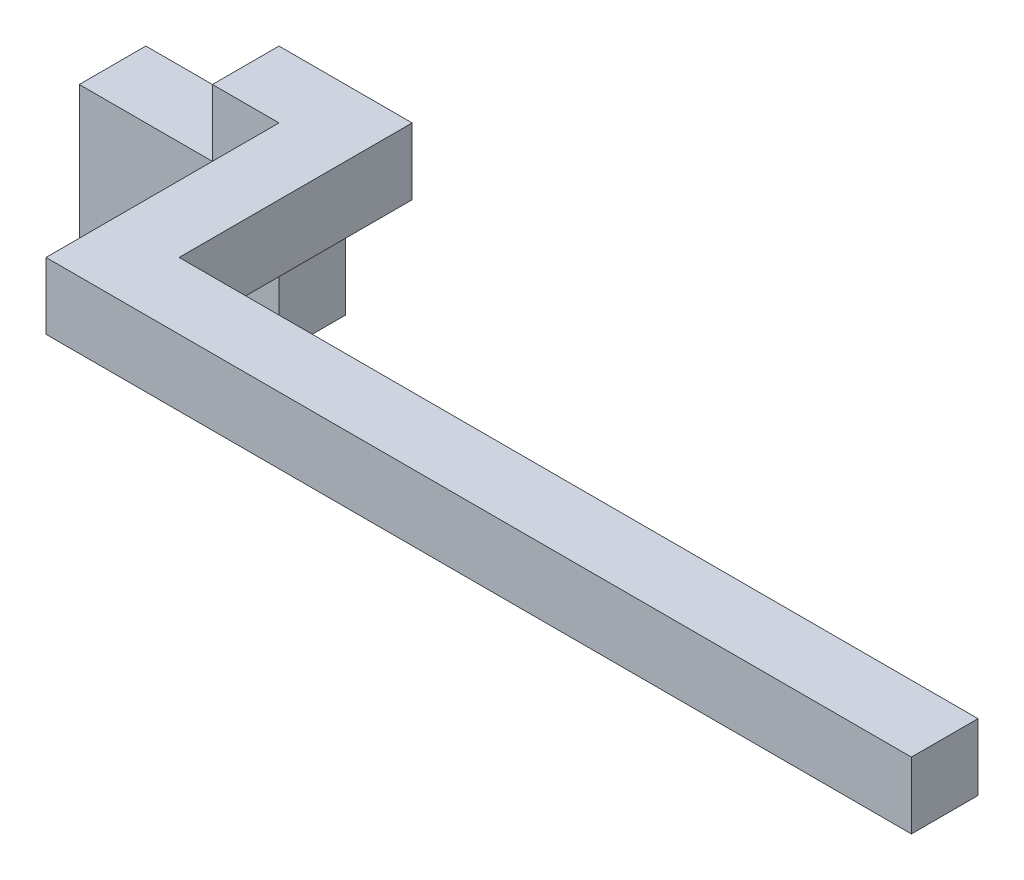
ISO-10303-21;
HEADER;
FILE_DESCRIPTION(('STEP AP214'),'2;1');
FILE_NAME('part.step','',(''),(''),'','','');
FILE_SCHEMA(('AUTOMOTIVE_DESIGN { 1 0 10303 214 1 1 1 1 }'));
ENDSEC;
DATA;
#1=APPLICATION_CONTEXT('core data for automotive mechanical design processes');
#2=APPLICATION_PROTOCOL_DEFINITION('international standard','automotive_design',2000,#1);
#3=PRODUCT_CONTEXT('',#1,'mechanical');
#4=PRODUCT('Part','Part','',(#3));
#5=PRODUCT_RELATED_PRODUCT_CATEGORY('part','',(#4));
#6=PRODUCT_DEFINITION_FORMATION('','',#4);
#7=PRODUCT_DEFINITION_CONTEXT('part definition',#1,'design');
#8=PRODUCT_DEFINITION('design','',#6,#7);
#9=PRODUCT_DEFINITION_SHAPE('','',#8);
#10=(LENGTH_UNIT() NAMED_UNIT(*) SI_UNIT(.MILLI.,.METRE.));
#11=(NAMED_UNIT(*) PLANE_ANGLE_UNIT() SI_UNIT($,.RADIAN.));
#12=(NAMED_UNIT(*) SI_UNIT($,.STERADIAN.) SOLID_ANGLE_UNIT());
#13=UNCERTAINTY_MEASURE_WITH_UNIT(LENGTH_MEASURE(1.E-05),#10,'distance_accuracy_value','');
#14=(GEOMETRIC_REPRESENTATION_CONTEXT(3) GLOBAL_UNCERTAINTY_ASSIGNED_CONTEXT((#13)) GLOBAL_UNIT_ASSIGNED_CONTEXT((#10,
#11,#12)) REPRESENTATION_CONTEXT('',''));
#15=CARTESIAN_POINT('',(0.,0.,0.));
#16=DIRECTION('',(0.,0.,1.));
#17=DIRECTION('',(1.,0.,0.));
#18=AXIS2_PLACEMENT_3D('',#15,#16,#17);
#19=CARTESIAN_POINT('',(330.2,-50.8,0.));
#20=DIRECTION('',(1.,0.,0.));
#21=DIRECTION('',(0.,0.,-1.));
#22=AXIS2_PLACEMENT_3D('',#19,#20,#21);
#23=PLANE('',#22);
#24=DIRECTION('',(0.,1.,0.));
#25=VECTOR('',#24,1.);
#26=CARTESIAN_POINT('',(330.2,-50.8,88.9));
#27=LINE('',#26,#25);
#28=CARTESIAN_POINT('',(330.2,0.,88.9));
#29=VERTEX_POINT('',#28);
#30=CARTESIAN_POINT('',(330.2,25.4,88.9));
#31=VERTEX_POINT('',#30);
#32=EDGE_CURVE('E192',#29,#31,#27,.T.);
#33=ORIENTED_EDGE('',*,*,#32,.T.);
#34=DIRECTION('',(0.,0.,1.));
#35=VECTOR('',#34,1.);
#36=CARTESIAN_POINT('',(330.2,25.4,0.));
#37=LINE('',#36,#35);
#38=CARTESIAN_POINT('',(330.2,25.4,114.3));
#39=VERTEX_POINT('',#38);
#40=EDGE_CURVE('E156',#31,#39,#37,.T.);
#41=ORIENTED_EDGE('',*,*,#40,.T.);
#42=DIRECTION('',(0.,1.,0.));
#43=VECTOR('',#42,1.);
#44=CARTESIAN_POINT('',(330.2,25.4,114.3));
#45=LINE('',#44,#43);
#46=CARTESIAN_POINT('',(330.2,0.,114.3));
#47=VERTEX_POINT('',#46);
#48=EDGE_CURVE('E169',#47,#39,#45,.T.);
#49=ORIENTED_EDGE('',*,*,#48,.F.);
#50=DIRECTION('',(0.,0.,-1.));
#51=VECTOR('',#50,1.);
#52=CARTESIAN_POINT('',(330.2,0.,25.4));
#53=LINE('',#52,#51);
#54=EDGE_CURVE('E164',#47,#29,#53,.T.);
#55=ORIENTED_EDGE('',*,*,#54,.T.);
#56=EDGE_LOOP('',(#33,#41,#49,#55));
#57=FACE_BOUND('',#56,.T.);
#58=ADVANCED_FACE('F33',(#57),#23,.T.);
#59=CARTESIAN_POINT('',(-76.2,-50.8,0.));
#60=DIRECTION('',(0.,-1.,0.));
#61=DIRECTION('',(0.,0.,-1.));
#62=AXIS2_PLACEMENT_3D('',#59,#60,#61);
#63=PLANE('',#62);
#64=DIRECTION('',(0.,0.,-1.));
#65=VECTOR('',#64,1.);
#66=CARTESIAN_POINT('',(0.,-50.8,25.4));
#67=LINE('',#66,#65);
#68=CARTESIAN_POINT('',(0.,-50.8,25.4));
#69=VERTEX_POINT('',#68);
#70=CARTESIAN_POINT('',(0.,-50.8,0.));
#71=VERTEX_POINT('',#70);
#72=EDGE_CURVE('E151',#69,#71,#67,.T.);
#73=ORIENTED_EDGE('',*,*,#72,.F.);
#74=DIRECTION('',(1.,0.,0.));
#75=VECTOR('',#74,1.);
#76=CARTESIAN_POINT('',(-76.2,-50.8,25.4));
#77=LINE('',#76,#75);
#78=CARTESIAN_POINT('',(-76.2,-50.8,25.4));
#79=VERTEX_POINT('',#78);
#80=EDGE_CURVE('E143',#79,#69,#77,.T.);
#81=ORIENTED_EDGE('',*,*,#80,.F.);
#82=DIRECTION('',(0.,0.,1.));
#83=VECTOR('',#82,1.);
#84=CARTESIAN_POINT('',(-76.2,-50.8,0.));
#85=LINE('',#84,#83);
#86=CARTESIAN_POINT('',(-76.2,-50.8,0.));
#87=VERTEX_POINT('',#86);
#88=EDGE_CURVE('E179',#87,#79,#85,.T.);
#89=ORIENTED_EDGE('',*,*,#88,.F.);
#90=DIRECTION('',(1.,0.,0.));
#91=VECTOR('',#90,1.);
#92=CARTESIAN_POINT('',(-76.2,-50.8,0.));
#93=LINE('',#92,#91);
#94=EDGE_CURVE('E145',#87,#71,#93,.T.);
#95=ORIENTED_EDGE('',*,*,#94,.T.);
#96=EDGE_LOOP('',(#73,#81,#89,#95));
#97=FACE_BOUND('',#96,.T.);
#98=ADVANCED_FACE('F227',(#97),#63,.T.);
#99=CARTESIAN_POINT('',(-76.2,25.4,0.));
#100=DIRECTION('',(-1.,0.,0.));
#101=DIRECTION('',(0.,0.,1.));
#102=AXIS2_PLACEMENT_3D('',#99,#100,#101);
#103=PLANE('',#102);
#104=DIRECTION('',(0.,0.,1.));
#105=VECTOR('',#104,1.);
#106=CARTESIAN_POINT('',(-76.2,0.,0.));
#107=LINE('',#106,#105);
#108=CARTESIAN_POINT('',(-76.2,0.,0.));
#109=VERTEX_POINT('',#108);
#110=CARTESIAN_POINT('',(-76.2,0.,25.4));
#111=VERTEX_POINT('',#110);
#112=EDGE_CURVE('E55',#109,#111,#107,.T.);
#113=ORIENTED_EDGE('',*,*,#112,.F.);
#114=DIRECTION('',(0.,-1.,0.));
#115=VECTOR('',#114,1.);
#116=CARTESIAN_POINT('',(-76.2,25.4,0.));
#117=LINE('',#116,#115);
#118=EDGE_CURVE('E142',#109,#87,#117,.T.);
#119=ORIENTED_EDGE('',*,*,#118,.T.);
#120=ORIENTED_EDGE('',*,*,#88,.T.);
#121=DIRECTION('',(0.,-1.,0.));
#122=VECTOR('',#121,1.);
#123=CARTESIAN_POINT('',(-76.2,25.4,25.4));
#124=LINE('',#123,#122);
#125=EDGE_CURVE('E148',#111,#79,#124,.T.);
#126=ORIENTED_EDGE('',*,*,#125,.F.);
#127=EDGE_LOOP('',(#113,#119,#120,#126));
#128=FACE_BOUND('',#127,.T.);
#129=ADVANCED_FACE('F232',(#128),#103,.T.);
#130=CARTESIAN_POINT('',(330.2,25.4,0.));
#131=DIRECTION('',(0.,1.,0.));
#132=DIRECTION('',(0.,0.,1.));
#133=AXIS2_PLACEMENT_3D('',#130,#131,#132);
#134=PLANE('',#133);
#135=DIRECTION('',(1.,0.,0.));
#136=VECTOR('',#135,1.);
#137=CARTESIAN_POINT('',(25.4,25.4,88.9));
#138=LINE('',#137,#136);
#139=CARTESIAN_POINT('',(25.4,25.4,88.9));
#140=VERTEX_POINT('',#139);
#141=EDGE_CURVE('E127',#140,#31,#138,.T.);
#142=ORIENTED_EDGE('',*,*,#141,.F.);
#143=DIRECTION('',(0.,0.,1.));
#144=VECTOR('',#143,1.);
#145=CARTESIAN_POINT('',(25.4,25.4,0.));
#146=LINE('',#145,#144);
#147=CARTESIAN_POINT('',(25.4,25.4,0.));
#148=VERTEX_POINT('',#147);
#149=EDGE_CURVE('E120',#148,#140,#146,.T.);
#150=ORIENTED_EDGE('',*,*,#149,.F.);
#151=DIRECTION('',(-1.,0.,0.));
#152=VECTOR('',#151,1.);
#153=CARTESIAN_POINT('',(330.2,25.4,0.));
#154=LINE('',#153,#152);
#155=CARTESIAN_POINT('',(-25.4,25.4,0.));
#156=VERTEX_POINT('',#155);
#157=EDGE_CURVE('E132',#148,#156,#154,.T.);
#158=ORIENTED_EDGE('',*,*,#157,.T.);
#159=DIRECTION('',(0.,0.,1.));
#160=VECTOR('',#159,1.);
#161=CARTESIAN_POINT('',(-25.4,25.4,0.));
#162=LINE('',#161,#160);
#163=CARTESIAN_POINT('',(-25.4,25.4,25.4));
#164=VERTEX_POINT('',#163);
#165=EDGE_CURVE('E170',#156,#164,#162,.T.);
#166=ORIENTED_EDGE('',*,*,#165,.T.);
#167=DIRECTION('',(-1.,0.,0.));
#168=VECTOR('',#167,1.);
#169=CARTESIAN_POINT('',(330.2,25.4,25.4));
#170=LINE('',#169,#168);
#171=CARTESIAN_POINT('',(0.,25.4,25.4));
#172=VERTEX_POINT('',#171);
#173=EDGE_CURVE('E160',#172,#164,#170,.T.);
#174=ORIENTED_EDGE('',*,*,#173,.F.);
#175=DIRECTION('',(0.,0.,-1.));
#176=VECTOR('',#175,1.);
#177=CARTESIAN_POINT('',(0.,25.4,114.3));
#178=LINE('',#177,#176);
#179=CARTESIAN_POINT('',(0.,25.4,114.3));
#180=VERTEX_POINT('',#179);
#181=EDGE_CURVE('E173',#180,#172,#178,.T.);
#182=ORIENTED_EDGE('',*,*,#181,.F.);
#183=DIRECTION('',(-1.,0.,0.));
#184=VECTOR('',#183,1.);
#185=CARTESIAN_POINT('',(0.,25.4,114.3));
#186=LINE('',#185,#184);
#187=EDGE_CURVE('E194',#39,#180,#186,.T.);
#188=ORIENTED_EDGE('',*,*,#187,.F.);
#189=ORIENTED_EDGE('',*,*,#40,.F.);
#190=EDGE_LOOP('',(#142,#150,#158,#166,#174,#182,#188,#189));
#191=FACE_BOUND('',#190,.T.);
#192=ADVANCED_FACE('F130',(#191),#134,.T.);
#193=CARTESIAN_POINT('',(0.,0.,0.));
#194=DIRECTION('',(0.,0.,1.));
#195=DIRECTION('',(1.,0.,0.));
#196=AXIS2_PLACEMENT_3D('',#193,#194,#195);
#197=PLANE('',#196);
#198=CARTESIAN_POINT('',(12.7,12.7,0.));
#199=DIRECTION('',(0.,0.,-1.));
#200=DIRECTION('',(0.,1.,0.));
#201=AXIS2_PLACEMENT_3D('',#198,#199,#200);
#202=CIRCLE('',#201,6.35000000000001);
#203=CARTESIAN_POINT('',(12.7,19.05,0.));
#204=VERTEX_POINT('',#203);
#205=EDGE_CURVE('E256',#204,#204,#202,.T.);
#206=ORIENTED_EDGE('',*,*,#205,.F.);
#207=EDGE_LOOP('',(#206));
#208=FACE_BOUND('',#207,.T.);
#209=ORIENTED_EDGE('',*,*,#157,.F.);
#210=DIRECTION('',(0.,1.,0.));
#211=VECTOR('',#210,1.);
#212=CARTESIAN_POINT('',(25.4,-50.8,0.));
#213=LINE('',#212,#211);
#214=CARTESIAN_POINT('',(25.4,0.,0.));
#215=VERTEX_POINT('',#214);
#216=EDGE_CURVE('E117',#215,#148,#213,.T.);
#217=ORIENTED_EDGE('',*,*,#216,.F.);
#218=DIRECTION('',(1.,0.,0.));
#219=VECTOR('',#218,1.);
#220=CARTESIAN_POINT('',(0.,0.,0.));
#221=LINE('',#220,#219);
#222=CARTESIAN_POINT('',(0.,0.,0.));
#223=VERTEX_POINT('',#222);
#224=EDGE_CURVE('E214',#223,#215,#221,.T.);
#225=ORIENTED_EDGE('',*,*,#224,.F.);
#226=DIRECTION('',(0.,1.,0.));
#227=VECTOR('',#226,1.);
#228=CARTESIAN_POINT('',(0.,-50.8,0.));
#229=LINE('',#228,#227);
#230=EDGE_CURVE('E176',#71,#223,#229,.T.);
#231=ORIENTED_EDGE('',*,*,#230,.F.);
#232=ORIENTED_EDGE('',*,*,#94,.F.);
#233=ORIENTED_EDGE('',*,*,#118,.F.);
#234=DIRECTION('',(1.,0.,0.));
#235=VECTOR('',#234,1.);
#236=CARTESIAN_POINT('',(-76.2,0.,0.));
#237=LINE('',#236,#235);
#238=CARTESIAN_POINT('',(-25.4,0.,0.));
#239=VERTEX_POINT('',#238);
#240=EDGE_CURVE('E234',#109,#239,#237,.T.);
#241=ORIENTED_EDGE('',*,*,#240,.T.);
#242=DIRECTION('',(0.,1.,0.));
#243=VECTOR('',#242,1.);
#244=CARTESIAN_POINT('',(-25.4,0.,0.));
#245=LINE('',#244,#243);
#246=EDGE_CURVE('E141',#239,#156,#245,.T.);
#247=ORIENTED_EDGE('',*,*,#246,.T.);
#248=EDGE_LOOP('',(#209,#217,#225,#231,#232,#233,#241,#247));
#249=FACE_BOUND('',#248,.T.);
#250=ADVANCED_FACE('F138',(#208,#249),#197,.F.);
#251=CARTESIAN_POINT('',(0.,0.,25.4));
#252=DIRECTION('',(0.,0.,1.));
#253=DIRECTION('',(1.,0.,0.));
#254=AXIS2_PLACEMENT_3D('',#251,#252,#253);
#255=PLANE('',#254);
#256=DIRECTION('',(0.,1.,0.));
#257=VECTOR('',#256,1.);
#258=CARTESIAN_POINT('',(-25.4,0.,25.4));
#259=LINE('',#258,#257);
#260=CARTESIAN_POINT('',(-25.4,0.,25.4));
#261=VERTEX_POINT('',#260);
#262=EDGE_CURVE('E235',#261,#164,#259,.T.);
#263=ORIENTED_EDGE('',*,*,#262,.F.);
#264=DIRECTION('',(1.,0.,0.));
#265=VECTOR('',#264,1.);
#266=CARTESIAN_POINT('',(-76.2,0.,25.4));
#267=LINE('',#266,#265);
#268=EDGE_CURVE('E231',#111,#261,#267,.T.);
#269=ORIENTED_EDGE('',*,*,#268,.F.);
#270=ORIENTED_EDGE('',*,*,#125,.T.);
#271=ORIENTED_EDGE('',*,*,#80,.T.);
#272=DIRECTION('',(0.,1.,0.));
#273=VECTOR('',#272,1.);
#274=CARTESIAN_POINT('',(0.,-50.8,25.4));
#275=LINE('',#274,#273);
#276=CARTESIAN_POINT('',(0.,0.,25.4));
#277=VERTEX_POINT('',#276);
#278=EDGE_CURVE('E212',#69,#277,#275,.T.);
#279=ORIENTED_EDGE('',*,*,#278,.T.);
#280=DIRECTION('',(0.,-1.,0.));
#281=VECTOR('',#280,1.);
#282=CARTESIAN_POINT('',(0.,0.,25.4));
#283=LINE('',#282,#281);
#284=EDGE_CURVE('E166',#172,#277,#283,.T.);
#285=ORIENTED_EDGE('',*,*,#284,.F.);
#286=ORIENTED_EDGE('',*,*,#173,.T.);
#287=EDGE_LOOP('',(#263,#269,#270,#271,#279,#285,#286));
#288=FACE_BOUND('',#287,.T.);
#289=ADVANCED_FACE('F230',(#288),#255,.T.);
#290=CARTESIAN_POINT('',(0.,0.,25.4));
#291=DIRECTION('',(0.,1.,0.));
#292=DIRECTION('',(0.,0.,1.));
#293=AXIS2_PLACEMENT_3D('',#290,#291,#292);
#294=PLANE('',#293);
#295=DIRECTION('',(0.,0.,1.));
#296=VECTOR('',#295,1.);
#297=CARTESIAN_POINT('',(25.4,0.,25.4));
#298=LINE('',#297,#296);
#299=CARTESIAN_POINT('',(25.4,0.,88.9));
#300=VERTEX_POINT('',#299);
#301=EDGE_CURVE('E40',#215,#300,#298,.T.);
#302=ORIENTED_EDGE('',*,*,#301,.T.);
#303=DIRECTION('',(1.,0.,0.));
#304=VECTOR('',#303,1.);
#305=CARTESIAN_POINT('',(0.,0.,88.9));
#306=LINE('',#305,#304);
#307=EDGE_CURVE('E11',#300,#29,#306,.T.);
#308=ORIENTED_EDGE('',*,*,#307,.T.);
#309=ORIENTED_EDGE('',*,*,#54,.F.);
#310=DIRECTION('',(1.,0.,0.));
#311=VECTOR('',#310,1.);
#312=CARTESIAN_POINT('',(330.2,0.,114.3));
#313=LINE('',#312,#311);
#314=CARTESIAN_POINT('',(0.,0.,114.3));
#315=VERTEX_POINT('',#314);
#316=EDGE_CURVE('E203',#315,#47,#313,.T.);
#317=ORIENTED_EDGE('',*,*,#316,.F.);
#318=DIRECTION('',(0.,0.,-1.));
#319=VECTOR('',#318,1.);
#320=CARTESIAN_POINT('',(0.,0.,114.3));
#321=LINE('',#320,#319);
#322=EDGE_CURVE('E177',#315,#277,#321,.T.);
#323=ORIENTED_EDGE('',*,*,#322,.T.);
#324=DIRECTION('',(0.,0.,-1.));
#325=VECTOR('',#324,1.);
#326=CARTESIAN_POINT('',(0.,0.,25.4));
#327=LINE('',#326,#325);
#328=EDGE_CURVE('E218',#277,#223,#327,.T.);
#329=ORIENTED_EDGE('',*,*,#328,.T.);
#330=ORIENTED_EDGE('',*,*,#224,.T.);
#331=EDGE_LOOP('',(#302,#308,#309,#317,#323,#329,#330));
#332=FACE_BOUND('',#331,.T.);
#333=ADVANCED_FACE('F248',(#332),#294,.F.);
#334=CARTESIAN_POINT('',(0.,-50.8,25.4));
#335=DIRECTION('',(-1.,0.,0.));
#336=DIRECTION('',(0.,0.,1.));
#337=AXIS2_PLACEMENT_3D('',#334,#335,#336);
#338=PLANE('',#337);
#339=ORIENTED_EDGE('',*,*,#230,.T.);
#340=ORIENTED_EDGE('',*,*,#328,.F.);
#341=ORIENTED_EDGE('',*,*,#278,.F.);
#342=ORIENTED_EDGE('',*,*,#72,.T.);
#343=EDGE_LOOP('',(#339,#340,#341,#342));
#344=FACE_BOUND('',#343,.T.);
#345=ADVANCED_FACE('F223',(#344),#338,.F.);
#346=CARTESIAN_POINT('',(0.,0.,114.3));
#347=DIRECTION('',(1.,0.,0.));
#348=DIRECTION('',(0.,0.,-1.));
#349=AXIS2_PLACEMENT_3D('',#346,#347,#348);
#350=PLANE('',#349);
#351=ORIENTED_EDGE('',*,*,#284,.T.);
#352=ORIENTED_EDGE('',*,*,#322,.F.);
#353=DIRECTION('',(0.,-1.,0.));
#354=VECTOR('',#353,1.);
#355=CARTESIAN_POINT('',(0.,0.,114.3));
#356=LINE('',#355,#354);
#357=EDGE_CURVE('E198',#180,#315,#356,.T.);
#358=ORIENTED_EDGE('',*,*,#357,.F.);
#359=ORIENTED_EDGE('',*,*,#181,.T.);
#360=EDGE_LOOP('',(#351,#352,#358,#359));
#361=FACE_BOUND('',#360,.T.);
#362=ADVANCED_FACE('F246',(#361),#350,.F.);
#363=CARTESIAN_POINT('',(0.,0.,114.3));
#364=DIRECTION('',(0.,0.,-1.));
#365=DIRECTION('',(-1.,0.,0.));
#366=AXIS2_PLACEMENT_3D('',#363,#364,#365);
#367=PLANE('',#366);
#368=ORIENTED_EDGE('',*,*,#48,.T.);
#369=ORIENTED_EDGE('',*,*,#187,.T.);
#370=ORIENTED_EDGE('',*,*,#357,.T.);
#371=ORIENTED_EDGE('',*,*,#316,.T.);
#372=EDGE_LOOP('',(#368,#369,#370,#371));
#373=FACE_BOUND('',#372,.T.);
#374=ADVANCED_FACE('F201',(#373),#367,.F.);
#375=CARTESIAN_POINT('',(-25.4,0.,0.));
#376=DIRECTION('',(1.,0.,0.));
#377=DIRECTION('',(0.,0.,-1.));
#378=AXIS2_PLACEMENT_3D('',#375,#376,#377);
#379=PLANE('',#378);
#380=ORIENTED_EDGE('',*,*,#262,.T.);
#381=ORIENTED_EDGE('',*,*,#165,.F.);
#382=ORIENTED_EDGE('',*,*,#246,.F.);
#383=DIRECTION('',(0.,0.,1.));
#384=VECTOR('',#383,1.);
#385=CARTESIAN_POINT('',(-25.4,0.,0.));
#386=LINE('',#385,#384);
#387=EDGE_CURVE('E233',#239,#261,#386,.T.);
#388=ORIENTED_EDGE('',*,*,#387,.T.);
#389=EDGE_LOOP('',(#380,#381,#382,#388));
#390=FACE_BOUND('',#389,.T.);
#391=ADVANCED_FACE('F243',(#390),#379,.F.);
#392=CARTESIAN_POINT('',(-76.2,0.,0.));
#393=DIRECTION('',(0.,-1.,0.));
#394=DIRECTION('',(0.,0.,-1.));
#395=AXIS2_PLACEMENT_3D('',#392,#393,#394);
#396=PLANE('',#395);
#397=ORIENTED_EDGE('',*,*,#268,.T.);
#398=ORIENTED_EDGE('',*,*,#387,.F.);
#399=ORIENTED_EDGE('',*,*,#240,.F.);
#400=ORIENTED_EDGE('',*,*,#112,.T.);
#401=EDGE_LOOP('',(#397,#398,#399,#400));
#402=FACE_BOUND('',#401,.T.);
#403=ADVANCED_FACE('F244',(#402),#396,.F.);
#404=CARTESIAN_POINT('',(25.4,-50.8,88.9));
#405=DIRECTION('',(0.,0.,1.));
#406=DIRECTION('',(1.,0.,0.));
#407=AXIS2_PLACEMENT_3D('',#404,#405,#406);
#408=PLANE('',#407);
#409=DIRECTION('',(0.,1.,0.));
#410=VECTOR('',#409,1.);
#411=CARTESIAN_POINT('',(25.4,-50.8,88.9));
#412=LINE('',#411,#410);
#413=EDGE_CURVE('E47',#300,#140,#412,.T.);
#414=ORIENTED_EDGE('',*,*,#413,.T.);
#415=ORIENTED_EDGE('',*,*,#141,.T.);
#416=ORIENTED_EDGE('',*,*,#32,.F.);
#417=ORIENTED_EDGE('',*,*,#307,.F.);
#418=EDGE_LOOP('',(#414,#415,#416,#417));
#419=FACE_BOUND('',#418,.T.);
#420=ADVANCED_FACE('F250',(#419),#408,.F.);
#421=CARTESIAN_POINT('',(25.4,-50.8,0.));
#422=DIRECTION('',(-1.,0.,0.));
#423=DIRECTION('',(0.,0.,1.));
#424=AXIS2_PLACEMENT_3D('',#421,#422,#423);
#425=PLANE('',#424);
#426=ORIENTED_EDGE('',*,*,#216,.T.);
#427=ORIENTED_EDGE('',*,*,#149,.T.);
#428=ORIENTED_EDGE('',*,*,#413,.F.);
#429=ORIENTED_EDGE('',*,*,#301,.F.);
#430=EDGE_LOOP('',(#426,#427,#428,#429));
#431=FACE_BOUND('',#430,.T.);
#432=ADVANCED_FACE('F119',(#431),#425,.F.);
#433=CARTESIAN_POINT('',(12.7,12.7,3.302));
#434=DIRECTION('',(0.,0.,1.));
#435=DIRECTION('',(0.,-1.,0.));
#436=AXIS2_PLACEMENT_3D('',#433,#434,#435);
#437=PLANE('',#436);
#438=CARTESIAN_POINT('',(12.7,12.7,3.302));
#439=DIRECTION('',(0.,0.,-1.));
#440=DIRECTION('',(0.,1.,0.));
#441=AXIS2_PLACEMENT_3D('',#438,#439,#440);
#442=CIRCLE('',#441,6.35000000000001);
#443=CARTESIAN_POINT('',(12.7,19.05,3.302));
#444=VERTEX_POINT('',#443);
#445=EDGE_CURVE('E135',#444,#444,#442,.T.);
#446=ORIENTED_EDGE('',*,*,#445,.T.);
#447=EDGE_LOOP('',(#446));
#448=FACE_BOUND('',#447,.T.);
#449=ADVANCED_FACE('F320',(#448),#437,.F.);
#450=CARTESIAN_POINT('',(12.7,12.7,0.));
#451=DIRECTION('',(0.,0.,-1.));
#452=DIRECTION('',(0.,1.,0.));
#453=AXIS2_PLACEMENT_3D('',#450,#451,#452);
#454=CYLINDRICAL_SURFACE('',#453,6.35000000000001);
#455=ORIENTED_EDGE('',*,*,#445,.F.);
#456=EDGE_LOOP('',(#455));
#457=FACE_BOUND('',#456,.T.);
#458=ORIENTED_EDGE('',*,*,#205,.T.);
#459=EDGE_LOOP('',(#458));
#460=FACE_BOUND('',#459,.T.);
#461=ADVANCED_FACE('F260',(#457,#460),#454,.F.);
#462=CLOSED_SHELL('',(#58,#98,#129,#192,#250,#289,#333,#345,#362,#374,#391,#403,#420,#432,#449,#461));
#463=MANIFOLD_SOLID_BREP('B2',#462);
#464=ADVANCED_BREP_SHAPE_REPRESENTATION('',(#18,#463),#14);
#465=SHAPE_DEFINITION_REPRESENTATION(#9,#464);
ENDSEC;
END-ISO-10303-21;
